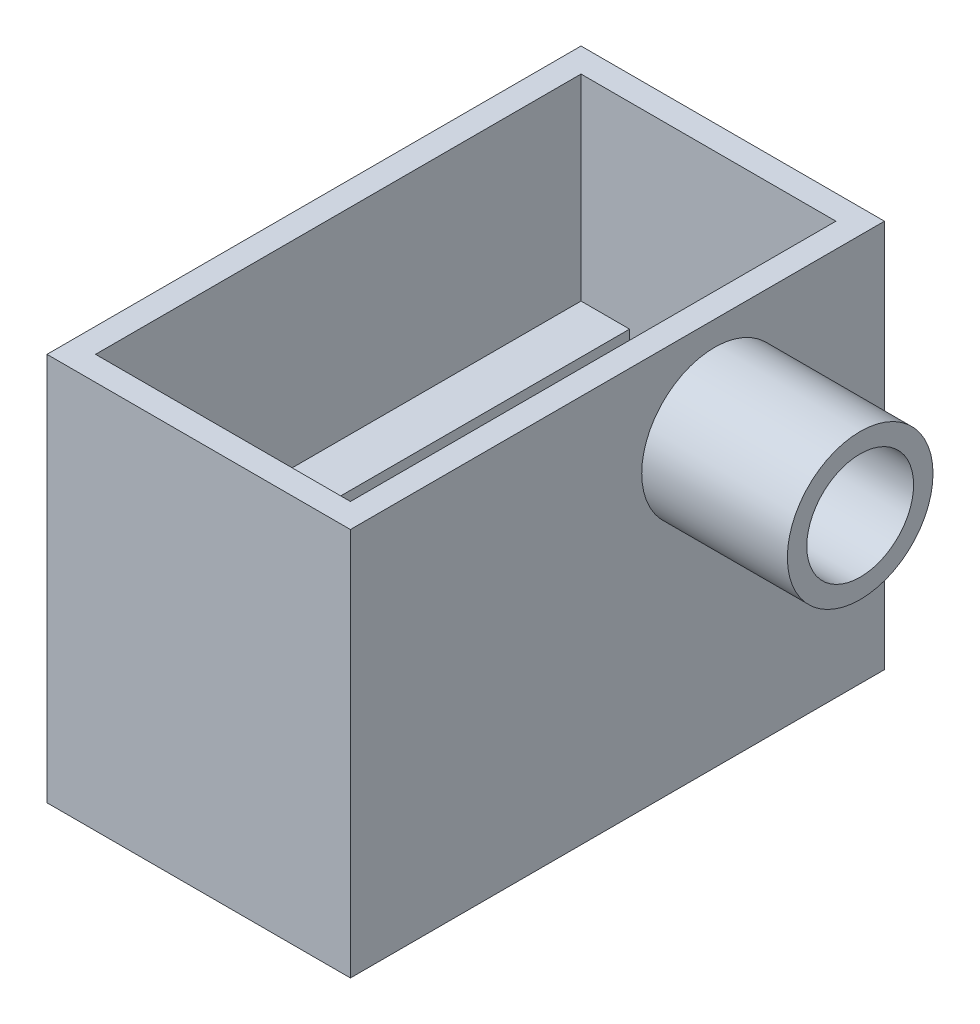
ISO-10303-21;
HEADER;
FILE_DESCRIPTION(('STEP AP214'),'2;1');
FILE_NAME('part.step','',(''),(''),'','','');
FILE_SCHEMA(('AUTOMOTIVE_DESIGN { 1 0 10303 214 1 1 1 1 }'));
ENDSEC;
DATA;
#1=APPLICATION_CONTEXT('core data for automotive mechanical design processes');
#2=APPLICATION_PROTOCOL_DEFINITION('international standard','automotive_design',2000,#1);
#3=PRODUCT_CONTEXT('',#1,'mechanical');
#4=PRODUCT('Part','Part','',(#3));
#5=PRODUCT_RELATED_PRODUCT_CATEGORY('part','',(#4));
#6=PRODUCT_DEFINITION_FORMATION('','',#4);
#7=PRODUCT_DEFINITION_CONTEXT('part definition',#1,'design');
#8=PRODUCT_DEFINITION('design','',#6,#7);
#9=PRODUCT_DEFINITION_SHAPE('','',#8);
#10=(LENGTH_UNIT() NAMED_UNIT(*) SI_UNIT(.MILLI.,.METRE.));
#11=(NAMED_UNIT(*) PLANE_ANGLE_UNIT() SI_UNIT($,.RADIAN.));
#12=(NAMED_UNIT(*) SI_UNIT($,.STERADIAN.) SOLID_ANGLE_UNIT());
#13=UNCERTAINTY_MEASURE_WITH_UNIT(LENGTH_MEASURE(1.E-05),#10,'distance_accuracy_value','');
#14=(GEOMETRIC_REPRESENTATION_CONTEXT(3) GLOBAL_UNCERTAINTY_ASSIGNED_CONTEXT((#13)) GLOBAL_UNIT_ASSIGNED_CONTEXT((#10,
#11,#12)) REPRESENTATION_CONTEXT('',''));
#15=CARTESIAN_POINT('',(0.,0.,0.));
#16=DIRECTION('',(0.,0.,1.));
#17=DIRECTION('',(1.,0.,0.));
#18=AXIS2_PLACEMENT_3D('',#15,#16,#17);
#19=CARTESIAN_POINT('',(2.75000000000001,-0.000999999999999265,0.99999999999998));
#20=DIRECTION('',(0.,1.,0.));
#21=DIRECTION('',(0.,0.,1.));
#22=AXIS2_PLACEMENT_3D('',#19,#20,#21);
#23=CYLINDRICAL_SURFACE('',#22,14.5);
#24=CARTESIAN_POINT('',(2.75000000000001,0.,0.99999999999998));
#25=DIRECTION('',(0.,-1.,0.));
#26=DIRECTION('',(0.,0.,-1.));
#27=AXIS2_PLACEMENT_3D('',#24,#25,#26);
#28=CIRCLE('',#27,14.5);
#29=CARTESIAN_POINT('',(2.75000000000001,0.,-13.5));
#30=VERTEX_POINT('',#29);
#31=EDGE_CURVE('E266',#30,#30,#28,.F.);
#32=ORIENTED_EDGE('',*,*,#31,.F.);
#33=EDGE_LOOP('',(#32));
#34=FACE_BOUND('',#33,.T.);
#35=CARTESIAN_POINT('',(2.75000000000001,3.,0.99999999999998));
#36=DIRECTION('',(0.,1.,0.));
#37=DIRECTION('',(0.,0.,1.));
#38=AXIS2_PLACEMENT_3D('',#35,#36,#37);
#39=CIRCLE('',#38,14.5);
#40=CARTESIAN_POINT('',(2.75000000000001,3.,15.5));
#41=VERTEX_POINT('',#40);
#42=EDGE_CURVE('E275',#41,#41,#39,.T.);
#43=ORIENTED_EDGE('',*,*,#42,.T.);
#44=EDGE_LOOP('',(#43));
#45=FACE_BOUND('',#44,.T.);
#46=ADVANCED_FACE('F34',(#34,#45),#23,.F.);
#47=CARTESIAN_POINT('',(-26.25,80.,55.));
#48=DIRECTION('',(1.,0.,0.));
#49=DIRECTION('',(0.,0.,-1.));
#50=AXIS2_PLACEMENT_3D('',#47,#48,#49);
#51=PLANE('',#50);
#52=DIRECTION('',(0.,0.,-1.));
#53=VECTOR('',#52,1.);
#54=CARTESIAN_POINT('',(-26.25,34.5,55.));
#55=LINE('',#54,#53);
#56=CARTESIAN_POINT('',(-26.25,34.5,50.));
#57=VERTEX_POINT('',#56);
#58=CARTESIAN_POINT('',(-26.25,34.5,-50.));
#59=VERTEX_POINT('',#58);
#60=EDGE_CURVE('E132',#57,#59,#55,.T.);
#61=ORIENTED_EDGE('',*,*,#60,.F.);
#62=DIRECTION('',(0.,-1.,0.));
#63=VECTOR('',#62,1.);
#64=CARTESIAN_POINT('',(-26.25,80.,50.));
#65=LINE('',#64,#63);
#66=CARTESIAN_POINT('',(-26.25,11.,50.));
#67=VERTEX_POINT('',#66);
#68=EDGE_CURVE('E171',#57,#67,#65,.T.);
#69=ORIENTED_EDGE('',*,*,#68,.T.);
#70=DIRECTION('',(0.,0.,1.));
#71=VECTOR('',#70,1.);
#72=CARTESIAN_POINT('',(-26.25,11.,0.));
#73=LINE('',#72,#71);
#74=CARTESIAN_POINT('',(-26.25,11.,-50.));
#75=VERTEX_POINT('',#74);
#76=EDGE_CURVE('E175',#75,#67,#73,.T.);
#77=ORIENTED_EDGE('',*,*,#76,.F.);
#78=DIRECTION('',(0.,-1.,0.));
#79=VECTOR('',#78,1.);
#80=CARTESIAN_POINT('',(-26.25,80.,-50.));
#81=LINE('',#80,#79);
#82=EDGE_CURVE('E177',#59,#75,#81,.T.);
#83=ORIENTED_EDGE('',*,*,#82,.F.);
#84=EDGE_LOOP('',(#61,#69,#77,#83));
#85=FACE_BOUND('',#84,.T.);
#86=ADVANCED_FACE('F241',(#85),#51,.T.);
#87=CARTESIAN_POINT('',(0.,80.,0.));
#88=DIRECTION('',(0.,-1.,0.));
#89=DIRECTION('',(0.,0.,-1.));
#90=AXIS2_PLACEMENT_3D('',#87,#88,#89);
#91=PLANE('',#90);
#92=DIRECTION('',(0.,0.,-1.));
#93=VECTOR('',#92,1.);
#94=CARTESIAN_POINT('',(31.25,80.,55.));
#95=LINE('',#94,#93);
#96=CARTESIAN_POINT('',(31.25,80.,55.));
#97=VERTEX_POINT('',#96);
#98=CARTESIAN_POINT('',(31.25,80.,-55.));
#99=VERTEX_POINT('',#98);
#100=EDGE_CURVE('E192',#97,#99,#95,.T.);
#101=ORIENTED_EDGE('',*,*,#100,.T.);
#102=DIRECTION('',(-1.,0.,0.));
#103=VECTOR('',#102,1.);
#104=CARTESIAN_POINT('',(-31.25,80.,-55.));
#105=LINE('',#104,#103);
#106=CARTESIAN_POINT('',(-31.25,80.,-55.));
#107=VERTEX_POINT('',#106);
#108=EDGE_CURVE('E195',#99,#107,#105,.T.);
#109=ORIENTED_EDGE('',*,*,#108,.T.);
#110=DIRECTION('',(0.,0.,1.));
#111=VECTOR('',#110,1.);
#112=CARTESIAN_POINT('',(-31.25,80.,55.));
#113=LINE('',#112,#111);
#114=CARTESIAN_POINT('',(-31.25,80.,55.));
#115=VERTEX_POINT('',#114);
#116=EDGE_CURVE('E198',#107,#115,#113,.T.);
#117=ORIENTED_EDGE('',*,*,#116,.T.);
#118=DIRECTION('',(1.,0.,0.));
#119=VECTOR('',#118,1.);
#120=CARTESIAN_POINT('',(-31.25,80.,55.));
#121=LINE('',#120,#119);
#122=EDGE_CURVE('E200',#115,#97,#121,.T.);
#123=ORIENTED_EDGE('',*,*,#122,.T.);
#124=EDGE_LOOP('',(#101,#109,#117,#123));
#125=FACE_BOUND('',#124,.T.);
#126=DIRECTION('',(0.,0.,-1.));
#127=VECTOR('',#126,1.);
#128=CARTESIAN_POINT('',(26.25,80.,0.));
#129=LINE('',#128,#127);
#130=CARTESIAN_POINT('',(26.25,80.,50.));
#131=VERTEX_POINT('',#130);
#132=CARTESIAN_POINT('',(26.25,80.,-50.));
#133=VERTEX_POINT('',#132);
#134=EDGE_CURVE('E184',#131,#133,#129,.T.);
#135=ORIENTED_EDGE('',*,*,#134,.F.);
#136=DIRECTION('',(1.,0.,0.));
#137=VECTOR('',#136,1.);
#138=CARTESIAN_POINT('',(0.,80.,50.));
#139=LINE('',#138,#137);
#140=CARTESIAN_POINT('',(-26.25,80.,50.));
#141=VERTEX_POINT('',#140);
#142=EDGE_CURVE('E172',#141,#131,#139,.T.);
#143=ORIENTED_EDGE('',*,*,#142,.F.);
#144=DIRECTION('',(0.,0.,1.));
#145=VECTOR('',#144,1.);
#146=CARTESIAN_POINT('',(-26.25,80.,0.));
#147=LINE('',#146,#145);
#148=CARTESIAN_POINT('',(-26.25,80.,-50.));
#149=VERTEX_POINT('',#148);
#150=EDGE_CURVE('E188',#149,#141,#147,.T.);
#151=ORIENTED_EDGE('',*,*,#150,.F.);
#152=DIRECTION('',(-1.,0.,0.));
#153=VECTOR('',#152,1.);
#154=CARTESIAN_POINT('',(0.,80.,-50.));
#155=LINE('',#154,#153);
#156=EDGE_CURVE('E186',#133,#149,#155,.T.);
#157=ORIENTED_EDGE('',*,*,#156,.F.);
#158=EDGE_LOOP('',(#135,#143,#151,#157));
#159=FACE_BOUND('',#158,.T.);
#160=ADVANCED_FACE('F238',(#125,#159),#91,.F.);
#161=CARTESIAN_POINT('',(31.25,80.,55.));
#162=DIRECTION('',(-1.,0.,0.));
#163=DIRECTION('',(0.,0.,1.));
#164=AXIS2_PLACEMENT_3D('',#161,#162,#163);
#165=PLANE('',#164);
#166=CARTESIAN_POINT('',(31.25,60.,-20.));
#167=DIRECTION('',(-1.,0.,0.));
#168=DIRECTION('',(0.,0.,1.));
#169=AXIS2_PLACEMENT_3D('',#166,#167,#168);
#170=CIRCLE('',#169,15.);
#171=CARTESIAN_POINT('',(31.25,60.,-5.00000000000002));
#172=VERTEX_POINT('',#171);
#173=EDGE_CURVE('E11',#172,#172,#170,.F.);
#174=ORIENTED_EDGE('',*,*,#173,.F.);
#175=EDGE_LOOP('',(#174));
#176=FACE_BOUND('',#175,.T.);
#177=DIRECTION('',(0.,0.,-1.));
#178=VECTOR('',#177,1.);
#179=CARTESIAN_POINT('',(31.25,0.,55.));
#180=LINE('',#179,#178);
#181=CARTESIAN_POINT('',(31.25,0.,55.));
#182=VERTEX_POINT('',#181);
#183=CARTESIAN_POINT('',(31.25,0.,-55.));
#184=VERTEX_POINT('',#183);
#185=EDGE_CURVE('E166',#182,#184,#180,.T.);
#186=ORIENTED_EDGE('',*,*,#185,.T.);
#187=DIRECTION('',(0.,-1.,0.));
#188=VECTOR('',#187,1.);
#189=CARTESIAN_POINT('',(31.25,80.,-55.));
#190=LINE('',#189,#188);
#191=EDGE_CURVE('E42',#99,#184,#190,.T.);
#192=ORIENTED_EDGE('',*,*,#191,.F.);
#193=ORIENTED_EDGE('',*,*,#100,.F.);
#194=DIRECTION('',(0.,-1.,0.));
#195=VECTOR('',#194,1.);
#196=CARTESIAN_POINT('',(31.25,80.,55.));
#197=LINE('',#196,#195);
#198=EDGE_CURVE('E202',#97,#182,#197,.T.);
#199=ORIENTED_EDGE('',*,*,#198,.T.);
#200=EDGE_LOOP('',(#186,#192,#193,#199));
#201=FACE_BOUND('',#200,.T.);
#202=ADVANCED_FACE('F36',(#176,#201),#165,.F.);
#203=CARTESIAN_POINT('',(-31.25,80.,-55.));
#204=DIRECTION('',(0.,0.,1.));
#205=DIRECTION('',(1.,0.,0.));
#206=AXIS2_PLACEMENT_3D('',#203,#204,#205);
#207=PLANE('',#206);
#208=DIRECTION('',(-1.,0.,0.));
#209=VECTOR('',#208,1.);
#210=CARTESIAN_POINT('',(-31.25,0.,-55.));
#211=LINE('',#210,#209);
#212=CARTESIAN_POINT('',(-31.25,0.,-55.));
#213=VERTEX_POINT('',#212);
#214=EDGE_CURVE('E205',#184,#213,#211,.T.);
#215=ORIENTED_EDGE('',*,*,#214,.T.);
#216=DIRECTION('',(0.,-1.,0.));
#217=VECTOR('',#216,1.);
#218=CARTESIAN_POINT('',(-31.25,80.,-55.));
#219=LINE('',#218,#217);
#220=EDGE_CURVE('E215',#107,#213,#219,.T.);
#221=ORIENTED_EDGE('',*,*,#220,.F.);
#222=ORIENTED_EDGE('',*,*,#108,.F.);
#223=ORIENTED_EDGE('',*,*,#191,.T.);
#224=EDGE_LOOP('',(#215,#221,#222,#223));
#225=FACE_BOUND('',#224,.T.);
#226=ADVANCED_FACE('F220',(#225),#207,.F.);
#227=CARTESIAN_POINT('',(-31.25,80.,55.));
#228=DIRECTION('',(1.,0.,0.));
#229=DIRECTION('',(0.,0.,-1.));
#230=AXIS2_PLACEMENT_3D('',#227,#228,#229);
#231=PLANE('',#230);
#232=DIRECTION('',(0.,0.,1.));
#233=VECTOR('',#232,1.);
#234=CARTESIAN_POINT('',(-31.25,0.,55.));
#235=LINE('',#234,#233);
#236=CARTESIAN_POINT('',(-31.25,0.,55.));
#237=VERTEX_POINT('',#236);
#238=EDGE_CURVE('E207',#213,#237,#235,.T.);
#239=ORIENTED_EDGE('',*,*,#238,.T.);
#240=DIRECTION('',(0.,-1.,0.));
#241=VECTOR('',#240,1.);
#242=CARTESIAN_POINT('',(-31.25,80.,55.));
#243=LINE('',#242,#241);
#244=EDGE_CURVE('E212',#115,#237,#243,.T.);
#245=ORIENTED_EDGE('',*,*,#244,.F.);
#246=ORIENTED_EDGE('',*,*,#116,.F.);
#247=ORIENTED_EDGE('',*,*,#220,.T.);
#248=EDGE_LOOP('',(#239,#245,#246,#247));
#249=FACE_BOUND('',#248,.T.);
#250=ADVANCED_FACE('F232',(#249),#231,.F.);
#251=CARTESIAN_POINT('',(-31.25,80.,55.));
#252=DIRECTION('',(0.,0.,-1.));
#253=DIRECTION('',(-1.,0.,0.));
#254=AXIS2_PLACEMENT_3D('',#251,#252,#253);
#255=PLANE('',#254);
#256=DIRECTION('',(1.,0.,0.));
#257=VECTOR('',#256,1.);
#258=CARTESIAN_POINT('',(-31.25,0.,55.));
#259=LINE('',#258,#257);
#260=EDGE_CURVE('E196',#237,#182,#259,.T.);
#261=ORIENTED_EDGE('',*,*,#260,.T.);
#262=ORIENTED_EDGE('',*,*,#198,.F.);
#263=ORIENTED_EDGE('',*,*,#122,.F.);
#264=ORIENTED_EDGE('',*,*,#244,.T.);
#265=EDGE_LOOP('',(#261,#262,#263,#264));
#266=FACE_BOUND('',#265,.T.);
#267=ADVANCED_FACE('F236',(#266),#255,.F.);
#268=CARTESIAN_POINT('',(0.,0.,0.));
#269=DIRECTION('',(0.,-1.,0.));
#270=DIRECTION('',(0.,0.,-1.));
#271=AXIS2_PLACEMENT_3D('',#268,#269,#270);
#272=PLANE('',#271);
#273=CARTESIAN_POINT('',(2.75000000000001,0.,36.));
#274=DIRECTION('',(0.,1.,0.));
#275=DIRECTION('',(0.,0.,1.));
#276=AXIS2_PLACEMENT_3D('',#273,#274,#275);
#277=CIRCLE('',#276,4.76250000000001);
#278=CARTESIAN_POINT('',(2.75000000000001,0.,40.7625));
#279=VERTEX_POINT('',#278);
#280=EDGE_CURVE('E280',#279,#279,#277,.T.);
#281=ORIENTED_EDGE('',*,*,#280,.T.);
#282=EDGE_LOOP('',(#281));
#283=FACE_BOUND('',#282,.T.);
#284=CARTESIAN_POINT('',(2.75000000000001,0.,-34.));
#285=DIRECTION('',(0.,1.,0.));
#286=DIRECTION('',(0.,0.,1.));
#287=AXIS2_PLACEMENT_3D('',#284,#285,#286);
#288=CIRCLE('',#287,4.76250000000001);
#289=CARTESIAN_POINT('',(2.75000000000001,0.,-29.2375));
#290=VERTEX_POINT('',#289);
#291=EDGE_CURVE('E284',#290,#290,#288,.T.);
#292=ORIENTED_EDGE('',*,*,#291,.T.);
#293=EDGE_LOOP('',(#292));
#294=FACE_BOUND('',#293,.T.);
#295=ORIENTED_EDGE('',*,*,#31,.T.);
#296=EDGE_LOOP('',(#295));
#297=FACE_BOUND('',#296,.T.);
#298=ORIENTED_EDGE('',*,*,#185,.F.);
#299=ORIENTED_EDGE('',*,*,#260,.F.);
#300=ORIENTED_EDGE('',*,*,#238,.F.);
#301=ORIENTED_EDGE('',*,*,#214,.F.);
#302=EDGE_LOOP('',(#298,#299,#300,#301));
#303=FACE_BOUND('',#302,.T.);
#304=ADVANCED_FACE('F228',(#283,#294,#297,#303),#272,.T.);
#305=CARTESIAN_POINT('',(26.25,80.,55.));
#306=DIRECTION('',(-1.,0.,0.));
#307=DIRECTION('',(0.,0.,1.));
#308=AXIS2_PLACEMENT_3D('',#305,#306,#307);
#309=PLANE('',#308);
#310=CARTESIAN_POINT('',(26.25,60.,-20.));
#311=DIRECTION('',(-1.,0.,0.));
#312=DIRECTION('',(0.,0.,1.));
#313=AXIS2_PLACEMENT_3D('',#310,#311,#312);
#314=CIRCLE('',#313,11.);
#315=CARTESIAN_POINT('',(26.25,60.,-9.00000000000002));
#316=VERTEX_POINT('',#315);
#317=EDGE_CURVE('E150',#316,#316,#314,.F.);
#318=ORIENTED_EDGE('',*,*,#317,.T.);
#319=EDGE_LOOP('',(#318));
#320=FACE_BOUND('',#319,.T.);
#321=DIRECTION('',(0.,0.,-1.));
#322=VECTOR('',#321,1.);
#323=CARTESIAN_POINT('',(26.25,11.,0.));
#324=LINE('',#323,#322);
#325=CARTESIAN_POINT('',(26.25,11.,50.));
#326=VERTEX_POINT('',#325);
#327=CARTESIAN_POINT('',(26.25,11.,-50.));
#328=VERTEX_POINT('',#327);
#329=EDGE_CURVE('E159',#326,#328,#324,.T.);
#330=ORIENTED_EDGE('',*,*,#329,.F.);
#331=DIRECTION('',(0.,-1.,0.));
#332=VECTOR('',#331,1.);
#333=CARTESIAN_POINT('',(26.25,80.,50.));
#334=LINE('',#333,#332);
#335=EDGE_CURVE('E168',#131,#326,#334,.T.);
#336=ORIENTED_EDGE('',*,*,#335,.F.);
#337=ORIENTED_EDGE('',*,*,#134,.T.);
#338=DIRECTION('',(0.,-1.,0.));
#339=VECTOR('',#338,1.);
#340=CARTESIAN_POINT('',(26.25,80.,-50.));
#341=LINE('',#340,#339);
#342=EDGE_CURVE('E163',#133,#328,#341,.T.);
#343=ORIENTED_EDGE('',*,*,#342,.T.);
#344=EDGE_LOOP('',(#330,#336,#337,#343));
#345=FACE_BOUND('',#344,.T.);
#346=ADVANCED_FACE('F251',(#320,#345),#309,.T.);
#347=CARTESIAN_POINT('',(-31.25,80.,-50.));
#348=DIRECTION('',(0.,0.,1.));
#349=DIRECTION('',(1.,0.,0.));
#350=AXIS2_PLACEMENT_3D('',#347,#348,#349);
#351=PLANE('',#350);
#352=DIRECTION('',(1.,0.,0.));
#353=VECTOR('',#352,1.);
#354=CARTESIAN_POINT('',(-26.25,34.5,-50.));
#355=LINE('',#354,#353);
#356=CARTESIAN_POINT('',(-16.25,34.5,-50.));
#357=VERTEX_POINT('',#356);
#358=EDGE_CURVE('E147',#59,#357,#355,.T.);
#359=ORIENTED_EDGE('',*,*,#358,.F.);
#360=ORIENTED_EDGE('',*,*,#82,.T.);
#361=DIRECTION('',(-1.,0.,0.));
#362=VECTOR('',#361,1.);
#363=CARTESIAN_POINT('',(0.,11.,-50.));
#364=LINE('',#363,#362);
#365=EDGE_CURVE('E162',#328,#75,#364,.T.);
#366=ORIENTED_EDGE('',*,*,#365,.F.);
#367=ORIENTED_EDGE('',*,*,#342,.F.);
#368=ORIENTED_EDGE('',*,*,#156,.T.);
#369=CARTESIAN_POINT('',(-26.25,39.5,-50.));
#370=VERTEX_POINT('',#369);
#371=EDGE_CURVE('E167',#149,#370,#81,.T.);
#372=ORIENTED_EDGE('',*,*,#371,.T.);
#373=DIRECTION('',(1.,0.,0.));
#374=VECTOR('',#373,1.);
#375=CARTESIAN_POINT('',(-26.25,39.5,-50.));
#376=LINE('',#375,#374);
#377=CARTESIAN_POINT('',(-16.25,39.5,-50.));
#378=VERTEX_POINT('',#377);
#379=EDGE_CURVE('E54',#370,#378,#376,.T.);
#380=ORIENTED_EDGE('',*,*,#379,.T.);
#381=DIRECTION('',(0.,1.,0.));
#382=VECTOR('',#381,1.);
#383=CARTESIAN_POINT('',(-16.25,80.,-50.));
#384=LINE('',#383,#382);
#385=EDGE_CURVE('E49',#357,#378,#384,.T.);
#386=ORIENTED_EDGE('',*,*,#385,.F.);
#387=EDGE_LOOP('',(#359,#360,#366,#367,#368,#372,#380,#386));
#388=FACE_BOUND('',#387,.T.);
#389=ADVANCED_FACE('F252',(#388),#351,.T.);
#390=DIRECTION('',(0.,0.,1.));
#391=VECTOR('',#390,1.);
#392=CARTESIAN_POINT('',(-26.25,39.5,55.));
#393=LINE('',#392,#391);
#394=CARTESIAN_POINT('',(-26.25,39.5,50.));
#395=VERTEX_POINT('',#394);
#396=EDGE_CURVE('E138',#370,#395,#393,.T.);
#397=ORIENTED_EDGE('',*,*,#396,.F.);
#398=ORIENTED_EDGE('',*,*,#371,.F.);
#399=ORIENTED_EDGE('',*,*,#150,.T.);
#400=EDGE_CURVE('E181',#141,#395,#65,.T.);
#401=ORIENTED_EDGE('',*,*,#400,.T.);
#402=EDGE_LOOP('',(#397,#398,#399,#401));
#403=FACE_BOUND('',#402,.T.);
#404=ADVANCED_FACE('F333',(#403),#51,.T.);
#405=CARTESIAN_POINT('',(-31.25,80.,50.));
#406=DIRECTION('',(0.,0.,-1.));
#407=DIRECTION('',(-1.,0.,0.));
#408=AXIS2_PLACEMENT_3D('',#405,#406,#407);
#409=PLANE('',#408);
#410=DIRECTION('',(1.,0.,0.));
#411=VECTOR('',#410,1.);
#412=CARTESIAN_POINT('',(-26.25,34.5,50.));
#413=LINE('',#412,#411);
#414=CARTESIAN_POINT('',(-16.25,34.5,50.));
#415=VERTEX_POINT('',#414);
#416=EDGE_CURVE('E129',#57,#415,#413,.T.);
#417=ORIENTED_EDGE('',*,*,#416,.T.);
#418=DIRECTION('',(0.,-1.,0.));
#419=VECTOR('',#418,1.);
#420=CARTESIAN_POINT('',(-16.25,80.,50.));
#421=LINE('',#420,#419);
#422=CARTESIAN_POINT('',(-16.25,39.5,50.));
#423=VERTEX_POINT('',#422);
#424=EDGE_CURVE('E121',#423,#415,#421,.T.);
#425=ORIENTED_EDGE('',*,*,#424,.F.);
#426=DIRECTION('',(1.,0.,0.));
#427=VECTOR('',#426,1.);
#428=CARTESIAN_POINT('',(-26.25,39.5,50.));
#429=LINE('',#428,#427);
#430=EDGE_CURVE('E125',#395,#423,#429,.T.);
#431=ORIENTED_EDGE('',*,*,#430,.F.);
#432=ORIENTED_EDGE('',*,*,#400,.F.);
#433=ORIENTED_EDGE('',*,*,#142,.T.);
#434=ORIENTED_EDGE('',*,*,#335,.T.);
#435=DIRECTION('',(1.,0.,0.));
#436=VECTOR('',#435,1.);
#437=CARTESIAN_POINT('',(0.,11.,50.));
#438=LINE('',#437,#436);
#439=EDGE_CURVE('E180',#67,#326,#438,.T.);
#440=ORIENTED_EDGE('',*,*,#439,.F.);
#441=ORIENTED_EDGE('',*,*,#68,.F.);
#442=EDGE_LOOP('',(#417,#425,#431,#432,#433,#434,#440,#441));
#443=FACE_BOUND('',#442,.T.);
#444=ADVANCED_FACE('F123',(#443),#409,.T.);
#445=CARTESIAN_POINT('',(0.,11.,0.));
#446=DIRECTION('',(0.,-1.,0.));
#447=DIRECTION('',(0.,0.,-1.));
#448=AXIS2_PLACEMENT_3D('',#445,#446,#447);
#449=PLANE('',#448);
#450=CARTESIAN_POINT('',(2.75000000000001,11.,36.));
#451=DIRECTION('',(0.,1.,0.));
#452=DIRECTION('',(0.,0.,1.));
#453=AXIS2_PLACEMENT_3D('',#450,#451,#452);
#454=CIRCLE('',#453,4.76250000000001);
#455=CARTESIAN_POINT('',(2.75000000000001,11.,40.7625));
#456=VERTEX_POINT('',#455);
#457=EDGE_CURVE('E287',#456,#456,#454,.T.);
#458=ORIENTED_EDGE('',*,*,#457,.F.);
#459=EDGE_LOOP('',(#458));
#460=FACE_BOUND('',#459,.T.);
#461=CARTESIAN_POINT('',(2.75000000000001,11.,-34.));
#462=DIRECTION('',(0.,1.,0.));
#463=DIRECTION('',(0.,0.,1.));
#464=AXIS2_PLACEMENT_3D('',#461,#462,#463);
#465=CIRCLE('',#464,4.76250000000001);
#466=CARTESIAN_POINT('',(2.75000000000001,11.,-29.2375));
#467=VERTEX_POINT('',#466);
#468=EDGE_CURVE('E281',#467,#467,#465,.T.);
#469=ORIENTED_EDGE('',*,*,#468,.F.);
#470=EDGE_LOOP('',(#469));
#471=FACE_BOUND('',#470,.T.);
#472=CARTESIAN_POINT('',(2.75000000000001,11.,0.99999999999998));
#473=DIRECTION('',(0.,1.,0.));
#474=DIRECTION('',(0.,0.,1.));
#475=AXIS2_PLACEMENT_3D('',#472,#473,#474);
#476=CIRCLE('',#475,16.002);
#477=CARTESIAN_POINT('',(2.75000000000001,11.,17.002));
#478=VERTEX_POINT('',#477);
#479=EDGE_CURVE('E272',#478,#478,#476,.T.);
#480=ORIENTED_EDGE('',*,*,#479,.F.);
#481=EDGE_LOOP('',(#480));
#482=FACE_BOUND('',#481,.T.);
#483=ORIENTED_EDGE('',*,*,#329,.T.);
#484=ORIENTED_EDGE('',*,*,#365,.T.);
#485=ORIENTED_EDGE('',*,*,#76,.T.);
#486=ORIENTED_EDGE('',*,*,#439,.T.);
#487=EDGE_LOOP('',(#483,#484,#485,#486));
#488=FACE_BOUND('',#487,.T.);
#489=ADVANCED_FACE('F257',(#460,#471,#482,#488),#449,.F.);
#490=CARTESIAN_POINT('',(61.25,60.,-20.));
#491=DIRECTION('',(1.,0.,0.));
#492=DIRECTION('',(0.,0.,-1.));
#493=AXIS2_PLACEMENT_3D('',#490,#491,#492);
#494=PLANE('',#493);
#495=CARTESIAN_POINT('',(61.25,60.,-20.));
#496=DIRECTION('',(1.,0.,0.));
#497=DIRECTION('',(0.,0.,-1.));
#498=AXIS2_PLACEMENT_3D('',#495,#496,#497);
#499=CIRCLE('',#498,15.);
#500=CARTESIAN_POINT('',(61.25,60.,-35.));
#501=VERTEX_POINT('',#500);
#502=EDGE_CURVE('E156',#501,#501,#499,.T.);
#503=ORIENTED_EDGE('',*,*,#502,.T.);
#504=EDGE_LOOP('',(#503));
#505=FACE_BOUND('',#504,.T.);
#506=CARTESIAN_POINT('',(61.25,60.,-20.));
#507=DIRECTION('',(1.,0.,0.));
#508=DIRECTION('',(0.,0.,-1.));
#509=AXIS2_PLACEMENT_3D('',#506,#507,#508);
#510=CIRCLE('',#509,11.);
#511=CARTESIAN_POINT('',(61.25,60.,-31.));
#512=VERTEX_POINT('',#511);
#513=EDGE_CURVE('E153',#512,#512,#510,.T.);
#514=ORIENTED_EDGE('',*,*,#513,.F.);
#515=EDGE_LOOP('',(#514));
#516=FACE_BOUND('',#515,.T.);
#517=ADVANCED_FACE('F304',(#505,#516),#494,.T.);
#518=CARTESIAN_POINT('',(61.25,60.,-20.));
#519=DIRECTION('',(-1.,0.,0.));
#520=DIRECTION('',(0.,0.,1.));
#521=AXIS2_PLACEMENT_3D('',#518,#519,#520);
#522=CYLINDRICAL_SURFACE('',#521,15.);
#523=ORIENTED_EDGE('',*,*,#502,.F.);
#524=EDGE_LOOP('',(#523));
#525=FACE_BOUND('',#524,.T.);
#526=ORIENTED_EDGE('',*,*,#173,.T.);
#527=EDGE_LOOP('',(#526));
#528=FACE_BOUND('',#527,.T.);
#529=ADVANCED_FACE('F341',(#525,#528),#522,.T.);
#530=CARTESIAN_POINT('',(61.25,60.,-20.));
#531=DIRECTION('',(-1.,0.,0.));
#532=DIRECTION('',(0.,0.,1.));
#533=AXIS2_PLACEMENT_3D('',#530,#531,#532);
#534=CYLINDRICAL_SURFACE('',#533,11.);
#535=ORIENTED_EDGE('',*,*,#513,.T.);
#536=EDGE_LOOP('',(#535));
#537=FACE_BOUND('',#536,.T.);
#538=ORIENTED_EDGE('',*,*,#317,.F.);
#539=EDGE_LOOP('',(#538));
#540=FACE_BOUND('',#539,.T.);
#541=ADVANCED_FACE('F322',(#537,#540),#534,.F.);
#542=CARTESIAN_POINT('',(-16.25,80.,55.));
#543=DIRECTION('',(1.,0.,0.));
#544=DIRECTION('',(0.,0.,-1.));
#545=AXIS2_PLACEMENT_3D('',#542,#543,#544);
#546=PLANE('',#545);
#547=ORIENTED_EDGE('',*,*,#385,.T.);
#548=DIRECTION('',(0.,0.,1.));
#549=VECTOR('',#548,1.);
#550=CARTESIAN_POINT('',(-16.25,39.5,55.));
#551=LINE('',#550,#549);
#552=EDGE_CURVE('E135',#378,#423,#551,.T.);
#553=ORIENTED_EDGE('',*,*,#552,.T.);
#554=ORIENTED_EDGE('',*,*,#424,.T.);
#555=DIRECTION('',(0.,0.,-1.));
#556=VECTOR('',#555,1.);
#557=CARTESIAN_POINT('',(-16.25,34.5,55.));
#558=LINE('',#557,#556);
#559=EDGE_CURVE('E145',#415,#357,#558,.T.);
#560=ORIENTED_EDGE('',*,*,#559,.T.);
#561=EDGE_LOOP('',(#547,#553,#554,#560));
#562=FACE_BOUND('',#561,.T.);
#563=ADVANCED_FACE('F136',(#562),#546,.T.);
#564=CARTESIAN_POINT('',(-26.25,34.5,55.));
#565=DIRECTION('',(0.,-1.,0.));
#566=DIRECTION('',(0.,0.,-1.));
#567=AXIS2_PLACEMENT_3D('',#564,#565,#566);
#568=PLANE('',#567);
#569=ORIENTED_EDGE('',*,*,#559,.F.);
#570=ORIENTED_EDGE('',*,*,#416,.F.);
#571=ORIENTED_EDGE('',*,*,#60,.T.);
#572=ORIENTED_EDGE('',*,*,#358,.T.);
#573=EDGE_LOOP('',(#569,#570,#571,#572));
#574=FACE_BOUND('',#573,.T.);
#575=ADVANCED_FACE('F262',(#574),#568,.T.);
#576=CARTESIAN_POINT('',(-26.25,39.5,55.));
#577=DIRECTION('',(0.,1.,0.));
#578=DIRECTION('',(0.,0.,1.));
#579=AXIS2_PLACEMENT_3D('',#576,#577,#578);
#580=PLANE('',#579);
#581=ORIENTED_EDGE('',*,*,#552,.F.);
#582=ORIENTED_EDGE('',*,*,#379,.F.);
#583=ORIENTED_EDGE('',*,*,#396,.T.);
#584=ORIENTED_EDGE('',*,*,#430,.T.);
#585=EDGE_LOOP('',(#581,#582,#583,#584));
#586=FACE_BOUND('',#585,.T.);
#587=ADVANCED_FACE('F141',(#586),#580,.T.);
#588=CARTESIAN_POINT('',(2.75000000000001,3.,0.99999999999998));
#589=DIRECTION('',(0.,1.,0.));
#590=DIRECTION('',(0.,0.,1.));
#591=AXIS2_PLACEMENT_3D('',#588,#589,#590);
#592=CYLINDRICAL_SURFACE('',#591,16.002);
#593=CARTESIAN_POINT('',(2.75000000000001,3.,0.99999999999998));
#594=DIRECTION('',(0.,1.,0.));
#595=DIRECTION('',(0.,0.,1.));
#596=AXIS2_PLACEMENT_3D('',#593,#594,#595);
#597=CIRCLE('',#596,16.002);
#598=CARTESIAN_POINT('',(2.75000000000001,3.,17.002));
#599=VERTEX_POINT('',#598);
#600=EDGE_CURVE('E271',#599,#599,#597,.T.);
#601=ORIENTED_EDGE('',*,*,#600,.F.);
#602=EDGE_LOOP('',(#601));
#603=FACE_BOUND('',#602,.T.);
#604=ORIENTED_EDGE('',*,*,#479,.T.);
#605=EDGE_LOOP('',(#604));
#606=FACE_BOUND('',#605,.T.);
#607=ADVANCED_FACE('F310',(#603,#606),#592,.F.);
#608=CARTESIAN_POINT('',(2.75000000000001,3.,0.99999999999998));
#609=DIRECTION('',(0.,1.,0.));
#610=DIRECTION('',(0.,0.,1.));
#611=AXIS2_PLACEMENT_3D('',#608,#609,#610);
#612=PLANE('',#611);
#613=ORIENTED_EDGE('',*,*,#42,.F.);
#614=EDGE_LOOP('',(#613));
#615=FACE_BOUND('',#614,.T.);
#616=ORIENTED_EDGE('',*,*,#600,.T.);
#617=EDGE_LOOP('',(#616));
#618=FACE_BOUND('',#617,.T.);
#619=ADVANCED_FACE('F312',(#615,#618),#612,.T.);
#620=CARTESIAN_POINT('',(2.75000000000001,0.,-34.));
#621=DIRECTION('',(0.,1.,0.));
#622=DIRECTION('',(0.,0.,1.));
#623=AXIS2_PLACEMENT_3D('',#620,#621,#622);
#624=CYLINDRICAL_SURFACE('',#623,4.76250000000001);
#625=ORIENTED_EDGE('',*,*,#291,.F.);
#626=EDGE_LOOP('',(#625));
#627=FACE_BOUND('',#626,.T.);
#628=ORIENTED_EDGE('',*,*,#468,.T.);
#629=EDGE_LOOP('',(#628));
#630=FACE_BOUND('',#629,.T.);
#631=ADVANCED_FACE('F298',(#627,#630),#624,.F.);
#632=CARTESIAN_POINT('',(2.75000000000001,0.,36.));
#633=DIRECTION('',(0.,1.,0.));
#634=DIRECTION('',(0.,0.,1.));
#635=AXIS2_PLACEMENT_3D('',#632,#633,#634);
#636=CYLINDRICAL_SURFACE('',#635,4.76250000000001);
#637=ORIENTED_EDGE('',*,*,#280,.F.);
#638=EDGE_LOOP('',(#637));
#639=FACE_BOUND('',#638,.T.);
#640=ORIENTED_EDGE('',*,*,#457,.T.);
#641=EDGE_LOOP('',(#640));
#642=FACE_BOUND('',#641,.T.);
#643=ADVANCED_FACE('F295',(#639,#642),#636,.F.);
#644=CLOSED_SHELL('',(#46,#86,#160,#202,#226,#250,#267,#304,#346,#389,#404,#444,#489,#517,#529,
#541,#563,#575,#587,#607,#619,#631,#643));
#645=MANIFOLD_SOLID_BREP('B2',#644);
#646=ADVANCED_BREP_SHAPE_REPRESENTATION('',(#18,#645),#14);
#647=SHAPE_DEFINITION_REPRESENTATION(#9,#646);
ENDSEC;
END-ISO-10303-21;
